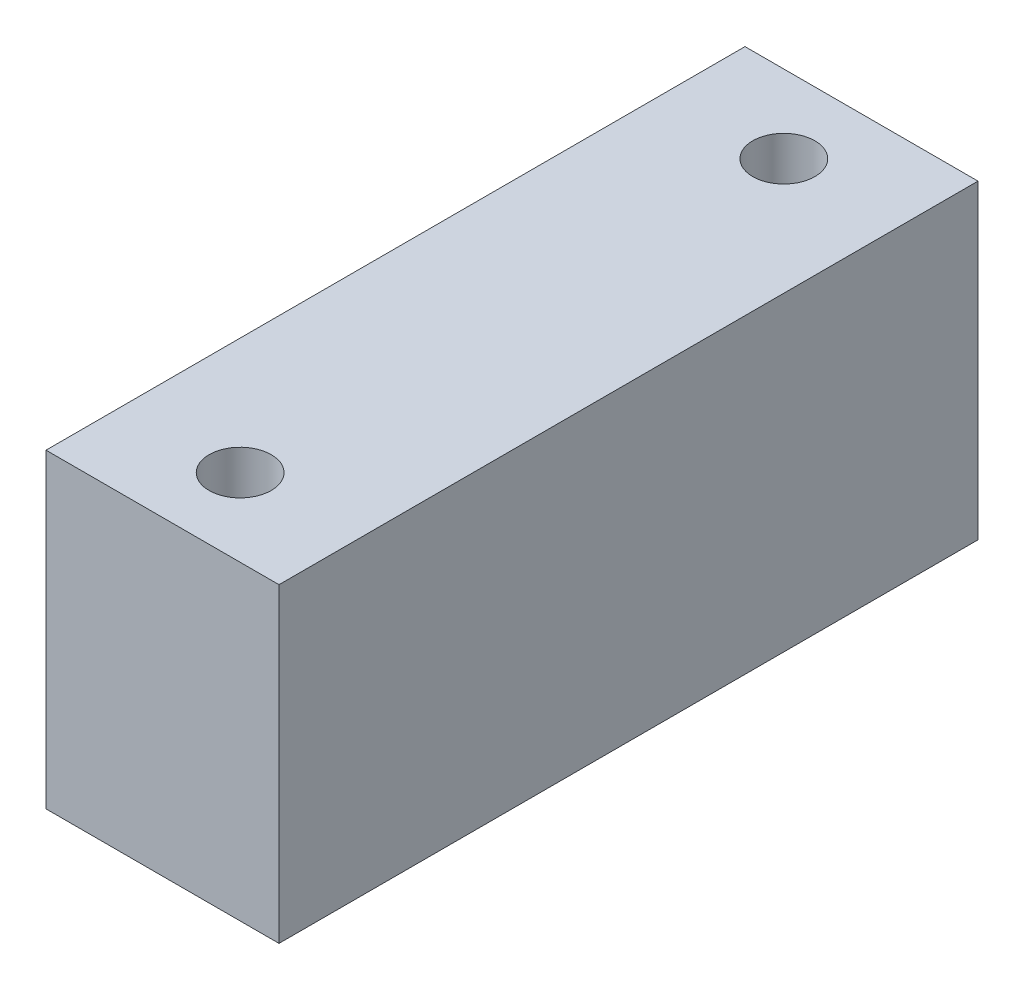
ISO-10303-21;
HEADER;
FILE_DESCRIPTION(('STEP AP214'),'2;1');
FILE_NAME('part.step','',(''),(''),'','','');
FILE_SCHEMA(('AUTOMOTIVE_DESIGN { 1 0 10303 214 1 1 1 1 }'));
ENDSEC;
DATA;
#1=APPLICATION_CONTEXT('core data for automotive mechanical design processes');
#2=APPLICATION_PROTOCOL_DEFINITION('international standard','automotive_design',2000,#1);
#3=PRODUCT_CONTEXT('',#1,'mechanical');
#4=PRODUCT('Part','Part','',(#3));
#5=PRODUCT_RELATED_PRODUCT_CATEGORY('part','',(#4));
#6=PRODUCT_DEFINITION_FORMATION('','',#4);
#7=PRODUCT_DEFINITION_CONTEXT('part definition',#1,'design');
#8=PRODUCT_DEFINITION('design','',#6,#7);
#9=PRODUCT_DEFINITION_SHAPE('','',#8);
#10=(LENGTH_UNIT() NAMED_UNIT(*) SI_UNIT(.MILLI.,.METRE.));
#11=(NAMED_UNIT(*) PLANE_ANGLE_UNIT() SI_UNIT($,.RADIAN.));
#12=(NAMED_UNIT(*) SI_UNIT($,.STERADIAN.) SOLID_ANGLE_UNIT());
#13=UNCERTAINTY_MEASURE_WITH_UNIT(LENGTH_MEASURE(1.E-05),#10,'distance_accuracy_value','');
#14=(GEOMETRIC_REPRESENTATION_CONTEXT(3) GLOBAL_UNCERTAINTY_ASSIGNED_CONTEXT((#13)) GLOBAL_UNIT_ASSIGNED_CONTEXT((#10,
#11,#12)) REPRESENTATION_CONTEXT('',''));
#15=CARTESIAN_POINT('',(0.,0.,0.));
#16=DIRECTION('',(0.,0.,1.));
#17=DIRECTION('',(1.,0.,0.));
#18=AXIS2_PLACEMENT_3D('',#15,#16,#17);
#19=CARTESIAN_POINT('',(0.,40.,0.));
#20=DIRECTION('',(0.,-1.,0.));
#21=DIRECTION('',(0.,0.,-1.));
#22=AXIS2_PLACEMENT_3D('',#19,#20,#21);
#23=PLANE('',#22);
#24=DIRECTION('',(0.,0.,-1.));
#25=VECTOR('',#24,1.);
#26=CARTESIAN_POINT('',(15.,40.,45.));
#27=LINE('',#26,#25);
#28=CARTESIAN_POINT('',(15.,40.,45.));
#29=VERTEX_POINT('',#28);
#30=CARTESIAN_POINT('',(15.,40.,-45.));
#31=VERTEX_POINT('',#30);
#32=EDGE_CURVE('E92',#29,#31,#27,.T.);
#33=ORIENTED_EDGE('',*,*,#32,.T.);
#34=DIRECTION('',(-1.,0.,0.));
#35=VECTOR('',#34,1.);
#36=CARTESIAN_POINT('',(-15.,40.,-45.));
#37=LINE('',#36,#35);
#38=CARTESIAN_POINT('',(-15.,40.,-45.));
#39=VERTEX_POINT('',#38);
#40=EDGE_CURVE('E87',#31,#39,#37,.T.);
#41=ORIENTED_EDGE('',*,*,#40,.T.);
#42=DIRECTION('',(0.,0.,1.));
#43=VECTOR('',#42,1.);
#44=CARTESIAN_POINT('',(-15.,40.,45.));
#45=LINE('',#44,#43);
#46=CARTESIAN_POINT('',(-15.,40.,45.));
#47=VERTEX_POINT('',#46);
#48=EDGE_CURVE('E90',#39,#47,#45,.T.);
#49=ORIENTED_EDGE('',*,*,#48,.T.);
#50=DIRECTION('',(1.,0.,0.));
#51=VECTOR('',#50,1.);
#52=CARTESIAN_POINT('',(-15.,40.,45.));
#53=LINE('',#52,#51);
#54=EDGE_CURVE('E57',#47,#29,#53,.T.);
#55=ORIENTED_EDGE('',*,*,#54,.T.);
#56=EDGE_LOOP('',(#33,#41,#49,#55));
#57=FACE_BOUND('',#56,.T.);
#58=CARTESIAN_POINT('',(0.,40.,-35.));
#59=DIRECTION('',(0.,1.,0.));
#60=DIRECTION('',(0.,0.,1.));
#61=AXIS2_PLACEMENT_3D('',#58,#59,#60);
#62=CIRCLE('',#61,4.);
#63=CARTESIAN_POINT('',(0.,40.,-31.));
#64=VERTEX_POINT('',#63);
#65=EDGE_CURVE('E112',#64,#64,#62,.T.);
#66=ORIENTED_EDGE('',*,*,#65,.F.);
#67=EDGE_LOOP('',(#66));
#68=FACE_BOUND('',#67,.T.);
#69=CARTESIAN_POINT('',(0.,40.,35.));
#70=DIRECTION('',(0.,1.,0.));
#71=DIRECTION('',(0.,0.,-1.));
#72=AXIS2_PLACEMENT_3D('',#69,#70,#71);
#73=CIRCLE('',#72,4.);
#74=CARTESIAN_POINT('',(0.,40.,31.));
#75=VERTEX_POINT('',#74);
#76=EDGE_CURVE('E134',#75,#75,#73,.T.);
#77=ORIENTED_EDGE('',*,*,#76,.F.);
#78=EDGE_LOOP('',(#77));
#79=FACE_BOUND('',#78,.T.);
#80=ADVANCED_FACE('F39',(#57,#68,#79),#23,.F.);
#81=CARTESIAN_POINT('',(0.,0.,0.));
#82=DIRECTION('',(0.,-1.,0.));
#83=DIRECTION('',(0.,0.,-1.));
#84=AXIS2_PLACEMENT_3D('',#81,#82,#83);
#85=PLANE('',#84);
#86=CARTESIAN_POINT('',(0.,0.,-35.));
#87=DIRECTION('',(0.,1.,0.));
#88=DIRECTION('',(0.,0.,1.));
#89=AXIS2_PLACEMENT_3D('',#86,#87,#88);
#90=CIRCLE('',#89,4.);
#91=CARTESIAN_POINT('',(0.,0.,-31.));
#92=VERTEX_POINT('',#91);
#93=EDGE_CURVE('E130',#92,#92,#90,.T.);
#94=ORIENTED_EDGE('',*,*,#93,.T.);
#95=EDGE_LOOP('',(#94));
#96=FACE_BOUND('',#95,.T.);
#97=DIRECTION('',(0.,0.,-1.));
#98=VECTOR('',#97,1.);
#99=CARTESIAN_POINT('',(15.,0.,45.));
#100=LINE('',#99,#98);
#101=CARTESIAN_POINT('',(15.,0.,45.));
#102=VERTEX_POINT('',#101);
#103=CARTESIAN_POINT('',(15.,0.,-45.));
#104=VERTEX_POINT('',#103);
#105=EDGE_CURVE('E108',#102,#104,#100,.T.);
#106=ORIENTED_EDGE('',*,*,#105,.F.);
#107=DIRECTION('',(1.,0.,0.));
#108=VECTOR('',#107,1.);
#109=CARTESIAN_POINT('',(-15.,0.,45.));
#110=LINE('',#109,#108);
#111=CARTESIAN_POINT('',(-15.,0.,45.));
#112=VERTEX_POINT('',#111);
#113=EDGE_CURVE('E80',#112,#102,#110,.T.);
#114=ORIENTED_EDGE('',*,*,#113,.F.);
#115=DIRECTION('',(0.,0.,1.));
#116=VECTOR('',#115,1.);
#117=CARTESIAN_POINT('',(-15.,0.,45.));
#118=LINE('',#117,#116);
#119=CARTESIAN_POINT('',(-15.,0.,-45.));
#120=VERTEX_POINT('',#119);
#121=EDGE_CURVE('E74',#120,#112,#118,.T.);
#122=ORIENTED_EDGE('',*,*,#121,.F.);
#123=DIRECTION('',(-1.,0.,0.));
#124=VECTOR('',#123,1.);
#125=CARTESIAN_POINT('',(-15.,0.,-45.));
#126=LINE('',#125,#124);
#127=EDGE_CURVE('E97',#104,#120,#126,.T.);
#128=ORIENTED_EDGE('',*,*,#127,.F.);
#129=EDGE_LOOP('',(#106,#114,#122,#128));
#130=FACE_BOUND('',#129,.T.);
#131=CARTESIAN_POINT('',(0.,0.,35.));
#132=DIRECTION('',(0.,1.,0.));
#133=DIRECTION('',(0.,0.,-1.));
#134=AXIS2_PLACEMENT_3D('',#131,#132,#133);
#135=CIRCLE('',#134,4.);
#136=CARTESIAN_POINT('',(0.,0.,31.));
#137=VERTEX_POINT('',#136);
#138=EDGE_CURVE('E138',#137,#137,#135,.T.);
#139=ORIENTED_EDGE('',*,*,#138,.T.);
#140=EDGE_LOOP('',(#139));
#141=FACE_BOUND('',#140,.T.);
#142=ADVANCED_FACE('F125',(#96,#130,#141),#85,.T.);
#143=CARTESIAN_POINT('',(15.,40.,45.));
#144=DIRECTION('',(-1.,0.,0.));
#145=DIRECTION('',(0.,0.,1.));
#146=AXIS2_PLACEMENT_3D('',#143,#144,#145);
#147=PLANE('',#146);
#148=ORIENTED_EDGE('',*,*,#105,.T.);
#149=DIRECTION('',(0.,-1.,0.));
#150=VECTOR('',#149,1.);
#151=CARTESIAN_POINT('',(15.,40.,-45.));
#152=LINE('',#151,#150);
#153=EDGE_CURVE('E11',#31,#104,#152,.T.);
#154=ORIENTED_EDGE('',*,*,#153,.F.);
#155=ORIENTED_EDGE('',*,*,#32,.F.);
#156=DIRECTION('',(0.,-1.,0.));
#157=VECTOR('',#156,1.);
#158=CARTESIAN_POINT('',(15.,40.,45.));
#159=LINE('',#158,#157);
#160=EDGE_CURVE('E104',#29,#102,#159,.T.);
#161=ORIENTED_EDGE('',*,*,#160,.T.);
#162=EDGE_LOOP('',(#148,#154,#155,#161));
#163=FACE_BOUND('',#162,.T.);
#164=ADVANCED_FACE('F41',(#163),#147,.F.);
#165=CARTESIAN_POINT('',(-15.,40.,-45.));
#166=DIRECTION('',(0.,0.,1.));
#167=DIRECTION('',(1.,0.,0.));
#168=AXIS2_PLACEMENT_3D('',#165,#166,#167);
#169=PLANE('',#168);
#170=ORIENTED_EDGE('',*,*,#127,.T.);
#171=DIRECTION('',(0.,-1.,0.));
#172=VECTOR('',#171,1.);
#173=CARTESIAN_POINT('',(-15.,40.,-45.));
#174=LINE('',#173,#172);
#175=EDGE_CURVE('E49',#39,#120,#174,.T.);
#176=ORIENTED_EDGE('',*,*,#175,.F.);
#177=ORIENTED_EDGE('',*,*,#40,.F.);
#178=ORIENTED_EDGE('',*,*,#153,.T.);
#179=EDGE_LOOP('',(#170,#176,#177,#178));
#180=FACE_BOUND('',#179,.T.);
#181=ADVANCED_FACE('F96',(#180),#169,.F.);
#182=CARTESIAN_POINT('',(-15.,40.,45.));
#183=DIRECTION('',(1.,0.,0.));
#184=DIRECTION('',(0.,0.,-1.));
#185=AXIS2_PLACEMENT_3D('',#182,#183,#184);
#186=PLANE('',#185);
#187=ORIENTED_EDGE('',*,*,#121,.T.);
#188=DIRECTION('',(0.,-1.,0.));
#189=VECTOR('',#188,1.);
#190=CARTESIAN_POINT('',(-15.,40.,45.));
#191=LINE('',#190,#189);
#192=EDGE_CURVE('E99',#47,#112,#191,.T.);
#193=ORIENTED_EDGE('',*,*,#192,.F.);
#194=ORIENTED_EDGE('',*,*,#48,.F.);
#195=ORIENTED_EDGE('',*,*,#175,.T.);
#196=EDGE_LOOP('',(#187,#193,#194,#195));
#197=FACE_BOUND('',#196,.T.);
#198=ADVANCED_FACE('F100',(#197),#186,.F.);
#199=CARTESIAN_POINT('',(-15.,40.,45.));
#200=DIRECTION('',(0.,0.,-1.));
#201=DIRECTION('',(-1.,0.,0.));
#202=AXIS2_PLACEMENT_3D('',#199,#200,#201);
#203=PLANE('',#202);
#204=ORIENTED_EDGE('',*,*,#113,.T.);
#205=ORIENTED_EDGE('',*,*,#160,.F.);
#206=ORIENTED_EDGE('',*,*,#54,.F.);
#207=ORIENTED_EDGE('',*,*,#192,.T.);
#208=EDGE_LOOP('',(#204,#205,#206,#207));
#209=FACE_BOUND('',#208,.T.);
#210=ADVANCED_FACE('F122',(#209),#203,.F.);
#211=CARTESIAN_POINT('',(0.,40.,-35.));
#212=DIRECTION('',(0.,-1.,0.));
#213=DIRECTION('',(0.,0.,-1.));
#214=AXIS2_PLACEMENT_3D('',#211,#212,#213);
#215=CYLINDRICAL_SURFACE('',#214,4.);
#216=ORIENTED_EDGE('',*,*,#65,.T.);
#217=EDGE_LOOP('',(#216));
#218=FACE_BOUND('',#217,.T.);
#219=ORIENTED_EDGE('',*,*,#93,.F.);
#220=EDGE_LOOP('',(#219));
#221=FACE_BOUND('',#220,.T.);
#222=ADVANCED_FACE('F157',(#218,#221),#215,.F.);
#223=CARTESIAN_POINT('',(0.,40.,35.));
#224=DIRECTION('',(0.,-1.,0.));
#225=DIRECTION('',(0.,0.,-1.));
#226=AXIS2_PLACEMENT_3D('',#223,#224,#225);
#227=CYLINDRICAL_SURFACE('',#226,4.);
#228=ORIENTED_EDGE('',*,*,#76,.T.);
#229=EDGE_LOOP('',(#228));
#230=FACE_BOUND('',#229,.T.);
#231=ORIENTED_EDGE('',*,*,#138,.F.);
#232=EDGE_LOOP('',(#231));
#233=FACE_BOUND('',#232,.T.);
#234=ADVANCED_FACE('F146',(#230,#233),#227,.F.);
#235=CLOSED_SHELL('',(#80,#142,#164,#181,#198,#210,#222,#234));
#236=MANIFOLD_SOLID_BREP('B2',#235);
#237=ADVANCED_BREP_SHAPE_REPRESENTATION('',(#18,#236),#14);
#238=SHAPE_DEFINITION_REPRESENTATION(#9,#237);
ENDSEC;
END-ISO-10303-21;
